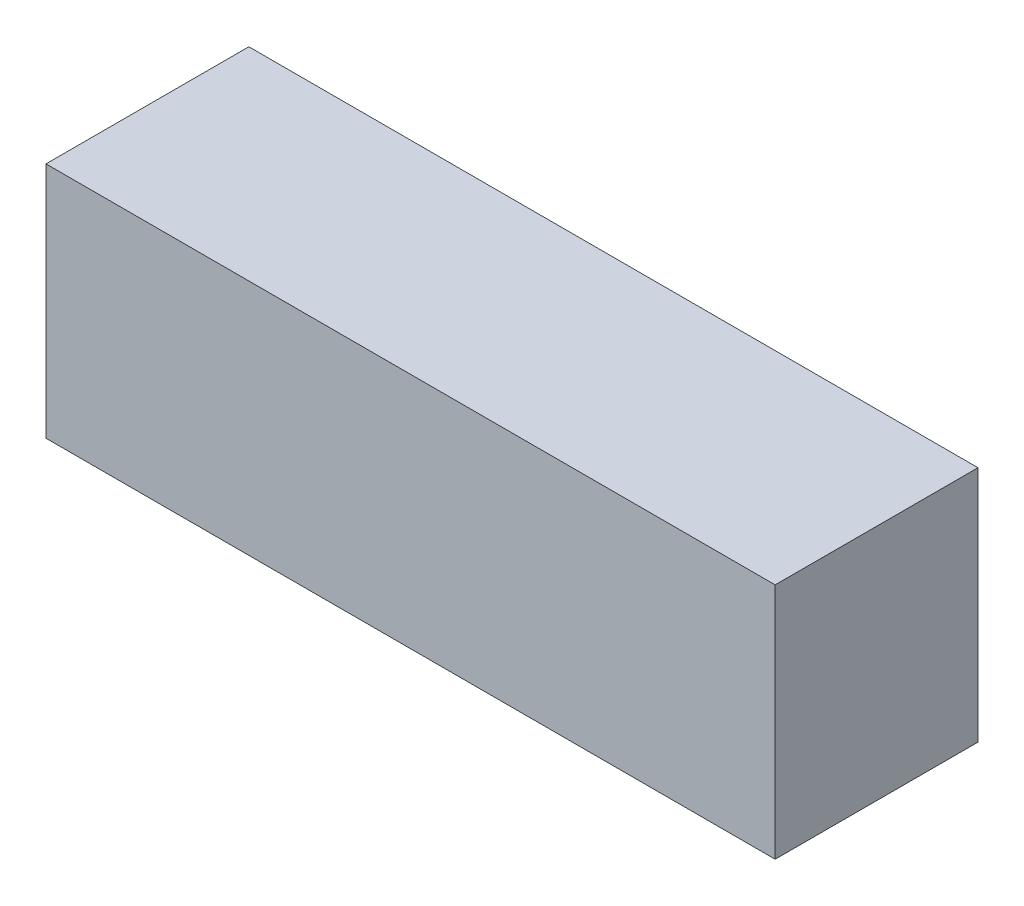
ISO-10303-21;
HEADER;
FILE_DESCRIPTION(('STEP AP214'),'2;1');
FILE_NAME('part.step','',(''),(''),'','','');
FILE_SCHEMA(('AUTOMOTIVE_DESIGN { 1 0 10303 214 1 1 1 1 }'));
ENDSEC;
DATA;
#1=APPLICATION_CONTEXT('core data for automotive mechanical design processes');
#2=APPLICATION_PROTOCOL_DEFINITION('international standard','automotive_design',2000,#1);
#3=PRODUCT_CONTEXT('',#1,'mechanical');
#4=PRODUCT('Part','Part','',(#3));
#5=PRODUCT_RELATED_PRODUCT_CATEGORY('part','',(#4));
#6=PRODUCT_DEFINITION_FORMATION('','',#4);
#7=PRODUCT_DEFINITION_CONTEXT('part definition',#1,'design');
#8=PRODUCT_DEFINITION('design','',#6,#7);
#9=PRODUCT_DEFINITION_SHAPE('','',#8);
#10=(LENGTH_UNIT() NAMED_UNIT(*) SI_UNIT(.MILLI.,.METRE.));
#11=(NAMED_UNIT(*) PLANE_ANGLE_UNIT() SI_UNIT($,.RADIAN.));
#12=(NAMED_UNIT(*) SI_UNIT($,.STERADIAN.) SOLID_ANGLE_UNIT());
#13=UNCERTAINTY_MEASURE_WITH_UNIT(LENGTH_MEASURE(1.E-05),#10,'distance_accuracy_value','');
#14=(GEOMETRIC_REPRESENTATION_CONTEXT(3) GLOBAL_UNCERTAINTY_ASSIGNED_CONTEXT((#13)) GLOBAL_UNIT_ASSIGNED_CONTEXT((#10,
#11,#12)) REPRESENTATION_CONTEXT('',''));
#15=CARTESIAN_POINT('',(0.,0.,0.));
#16=DIRECTION('',(0.,0.,1.));
#17=DIRECTION('',(1.,0.,0.));
#18=AXIS2_PLACEMENT_3D('',#15,#16,#17);
#19=CARTESIAN_POINT('',(0.,23.4188,0.));
#20=DIRECTION('',(1.,0.,0.));
#21=DIRECTION('',(0.,0.,-1.));
#22=AXIS2_PLACEMENT_3D('',#19,#20,#21);
#23=PLANE('',#22);
#24=DIRECTION('',(0.,0.,1.));
#25=VECTOR('',#24,1.);
#26=CARTESIAN_POINT('',(0.,0.,0.));
#27=LINE('',#26,#25);
#28=CARTESIAN_POINT('',(0.,0.,-19.9898));
#29=VERTEX_POINT('',#28);
#30=CARTESIAN_POINT('',(0.,0.,0.));
#31=VERTEX_POINT('',#30);
#32=EDGE_CURVE('E100',#29,#31,#27,.T.);
#33=ORIENTED_EDGE('',*,*,#32,.T.);
#34=DIRECTION('',(0.,-1.,0.));
#35=VECTOR('',#34,1.);
#36=CARTESIAN_POINT('',(0.,23.4188,0.));
#37=LINE('',#36,#35);
#38=CARTESIAN_POINT('',(0.,23.4188,0.));
#39=VERTEX_POINT('',#38);
#40=EDGE_CURVE('E11',#39,#31,#37,.T.);
#41=ORIENTED_EDGE('',*,*,#40,.F.);
#42=DIRECTION('',(0.,0.,1.));
#43=VECTOR('',#42,1.);
#44=CARTESIAN_POINT('',(0.,23.4188,0.));
#45=LINE('',#44,#43);
#46=CARTESIAN_POINT('',(0.,23.4188,-19.9898));
#47=VERTEX_POINT('',#46);
#48=EDGE_CURVE('E88',#47,#39,#45,.T.);
#49=ORIENTED_EDGE('',*,*,#48,.F.);
#50=DIRECTION('',(0.,-1.,0.));
#51=VECTOR('',#50,1.);
#52=CARTESIAN_POINT('',(0.,23.4188,-19.9898));
#53=LINE('',#52,#51);
#54=EDGE_CURVE('E96',#47,#29,#53,.T.);
#55=ORIENTED_EDGE('',*,*,#54,.T.);
#56=EDGE_LOOP('',(#33,#41,#49,#55));
#57=FACE_BOUND('',#56,.T.);
#58=ADVANCED_FACE('F37',(#57),#23,.F.);
#59=CARTESIAN_POINT('',(0.,23.4188,0.));
#60=DIRECTION('',(0.,0.,-1.));
#61=DIRECTION('',(-1.,0.,0.));
#62=AXIS2_PLACEMENT_3D('',#59,#60,#61);
#63=PLANE('',#62);
#64=DIRECTION('',(1.,0.,0.));
#65=VECTOR('',#64,1.);
#66=CARTESIAN_POINT('',(0.,0.,0.));
#67=LINE('',#66,#65);
#68=CARTESIAN_POINT('',(71.8566,0.,0.));
#69=VERTEX_POINT('',#68);
#70=EDGE_CURVE('E92',#31,#69,#67,.T.);
#71=ORIENTED_EDGE('',*,*,#70,.T.);
#72=DIRECTION('',(0.,-1.,0.));
#73=VECTOR('',#72,1.);
#74=CARTESIAN_POINT('',(71.8566,23.4188,0.));
#75=LINE('',#74,#73);
#76=CARTESIAN_POINT('',(71.8566,23.4188,0.));
#77=VERTEX_POINT('',#76);
#78=EDGE_CURVE('E45',#77,#69,#75,.T.);
#79=ORIENTED_EDGE('',*,*,#78,.F.);
#80=DIRECTION('',(1.,0.,0.));
#81=VECTOR('',#80,1.);
#82=CARTESIAN_POINT('',(0.,23.4188,0.));
#83=LINE('',#82,#81);
#84=EDGE_CURVE('E83',#39,#77,#83,.T.);
#85=ORIENTED_EDGE('',*,*,#84,.F.);
#86=ORIENTED_EDGE('',*,*,#40,.T.);
#87=EDGE_LOOP('',(#71,#79,#85,#86));
#88=FACE_BOUND('',#87,.T.);
#89=ADVANCED_FACE('F91',(#88),#63,.F.);
#90=CARTESIAN_POINT('',(71.8566,23.4188,0.));
#91=DIRECTION('',(-1.,0.,0.));
#92=DIRECTION('',(0.,0.,1.));
#93=AXIS2_PLACEMENT_3D('',#90,#91,#92);
#94=PLANE('',#93);
#95=DIRECTION('',(0.,0.,-1.));
#96=VECTOR('',#95,1.);
#97=CARTESIAN_POINT('',(71.8566,0.,0.));
#98=LINE('',#97,#96);
#99=CARTESIAN_POINT('',(71.8566,0.,-19.9898));
#100=VERTEX_POINT('',#99);
#101=EDGE_CURVE('E70',#69,#100,#98,.T.);
#102=ORIENTED_EDGE('',*,*,#101,.T.);
#103=DIRECTION('',(0.,-1.,0.));
#104=VECTOR('',#103,1.);
#105=CARTESIAN_POINT('',(71.8566,23.4188,-19.9898));
#106=LINE('',#105,#104);
#107=CARTESIAN_POINT('',(71.8566,23.4188,-19.9898));
#108=VERTEX_POINT('',#107);
#109=EDGE_CURVE('E93',#108,#100,#106,.T.);
#110=ORIENTED_EDGE('',*,*,#109,.F.);
#111=DIRECTION('',(0.,0.,-1.));
#112=VECTOR('',#111,1.);
#113=CARTESIAN_POINT('',(71.8566,23.4188,0.));
#114=LINE('',#113,#112);
#115=EDGE_CURVE('E86',#77,#108,#114,.T.);
#116=ORIENTED_EDGE('',*,*,#115,.F.);
#117=ORIENTED_EDGE('',*,*,#78,.T.);
#118=EDGE_LOOP('',(#102,#110,#116,#117));
#119=FACE_BOUND('',#118,.T.);
#120=ADVANCED_FACE('F94',(#119),#94,.F.);
#121=CARTESIAN_POINT('',(0.,23.4188,-19.9898));
#122=DIRECTION('',(0.,0.,1.));
#123=DIRECTION('',(1.,0.,0.));
#124=AXIS2_PLACEMENT_3D('',#121,#122,#123);
#125=PLANE('',#124);
#126=DIRECTION('',(-1.,0.,0.));
#127=VECTOR('',#126,1.);
#128=CARTESIAN_POINT('',(0.,0.,-19.9898));
#129=LINE('',#128,#127);
#130=EDGE_CURVE('E76',#100,#29,#129,.T.);
#131=ORIENTED_EDGE('',*,*,#130,.T.);
#132=ORIENTED_EDGE('',*,*,#54,.F.);
#133=DIRECTION('',(-1.,0.,0.));
#134=VECTOR('',#133,1.);
#135=CARTESIAN_POINT('',(0.,23.4188,-19.9898));
#136=LINE('',#135,#134);
#137=EDGE_CURVE('E53',#108,#47,#136,.T.);
#138=ORIENTED_EDGE('',*,*,#137,.F.);
#139=ORIENTED_EDGE('',*,*,#109,.T.);
#140=EDGE_LOOP('',(#131,#132,#138,#139));
#141=FACE_BOUND('',#140,.T.);
#142=ADVANCED_FACE('F107',(#141),#125,.F.);
#143=CARTESIAN_POINT('',(0.,23.4188,0.));
#144=DIRECTION('',(0.,-1.,0.));
#145=DIRECTION('',(0.,0.,-1.));
#146=AXIS2_PLACEMENT_3D('',#143,#144,#145);
#147=PLANE('',#146);
#148=ORIENTED_EDGE('',*,*,#48,.T.);
#149=ORIENTED_EDGE('',*,*,#84,.T.);
#150=ORIENTED_EDGE('',*,*,#115,.T.);
#151=ORIENTED_EDGE('',*,*,#137,.T.);
#152=EDGE_LOOP('',(#148,#149,#150,#151));
#153=FACE_BOUND('',#152,.T.);
#154=ADVANCED_FACE('F84',(#153),#147,.F.);
#155=CARTESIAN_POINT('',(0.,0.,0.));
#156=DIRECTION('',(0.,-1.,0.));
#157=DIRECTION('',(0.,0.,-1.));
#158=AXIS2_PLACEMENT_3D('',#155,#156,#157);
#159=PLANE('',#158);
#160=ORIENTED_EDGE('',*,*,#32,.F.);
#161=ORIENTED_EDGE('',*,*,#130,.F.);
#162=ORIENTED_EDGE('',*,*,#101,.F.);
#163=ORIENTED_EDGE('',*,*,#70,.F.);
#164=EDGE_LOOP('',(#160,#161,#162,#163));
#165=FACE_BOUND('',#164,.T.);
#166=ADVANCED_FACE('F110',(#165),#159,.T.);
#167=CLOSED_SHELL('',(#58,#89,#120,#142,#154,#166));
#168=MANIFOLD_SOLID_BREP('B2',#167);
#169=ADVANCED_BREP_SHAPE_REPRESENTATION('',(#18,#168),#14);
#170=SHAPE_DEFINITION_REPRESENTATION(#9,#169);
ENDSEC;
END-ISO-10303-21;
